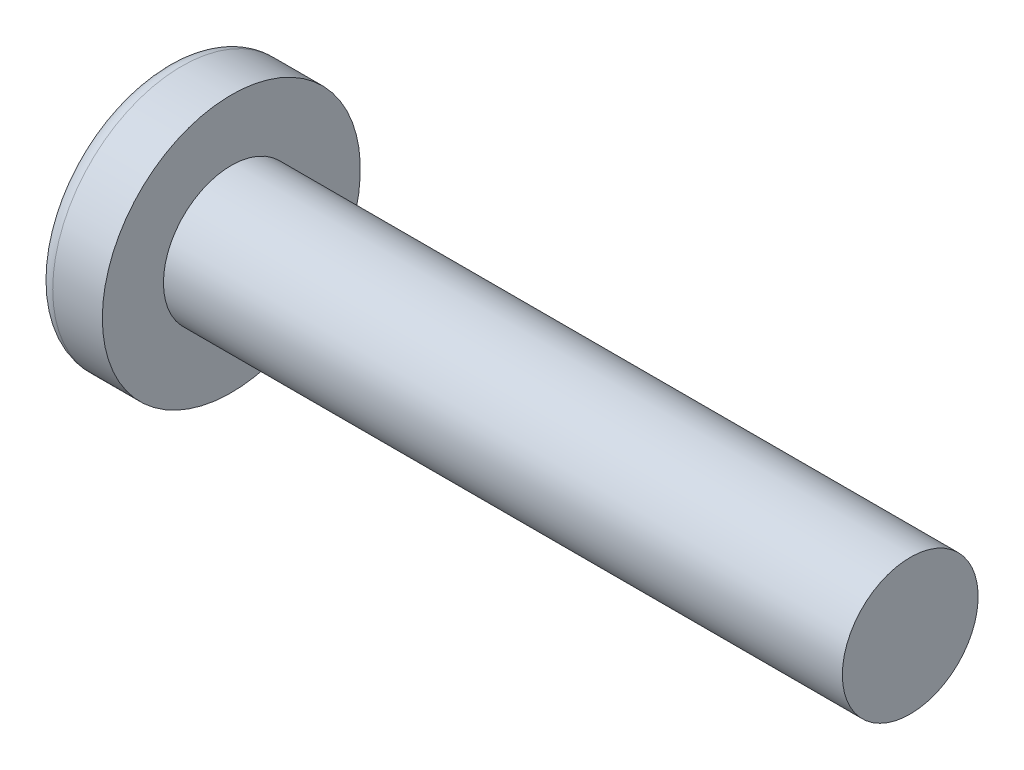
ISO-10303-21;
HEADER;
FILE_DESCRIPTION(('STEP AP214'),'2;1');
FILE_NAME('part.step','',(''),(''),'','','');
FILE_SCHEMA(('AUTOMOTIVE_DESIGN { 1 0 10303 214 1 1 1 1 }'));
ENDSEC;
DATA;
#1=APPLICATION_CONTEXT('core data for automotive mechanical design processes');
#2=APPLICATION_PROTOCOL_DEFINITION('international standard','automotive_design',2000,#1);
#3=PRODUCT_CONTEXT('',#1,'mechanical');
#4=PRODUCT('Part','Part','',(#3));
#5=PRODUCT_RELATED_PRODUCT_CATEGORY('part','',(#4));
#6=PRODUCT_DEFINITION_FORMATION('','',#4);
#7=PRODUCT_DEFINITION_CONTEXT('part definition',#1,'design');
#8=PRODUCT_DEFINITION('design','',#6,#7);
#9=PRODUCT_DEFINITION_SHAPE('','',#8);
#10=(LENGTH_UNIT() NAMED_UNIT(*) SI_UNIT(.MILLI.,.METRE.));
#11=(NAMED_UNIT(*) PLANE_ANGLE_UNIT() SI_UNIT($,.RADIAN.));
#12=(NAMED_UNIT(*) SI_UNIT($,.STERADIAN.) SOLID_ANGLE_UNIT());
#13=UNCERTAINTY_MEASURE_WITH_UNIT(LENGTH_MEASURE(1.E-05),#10,'distance_accuracy_value','');
#14=(GEOMETRIC_REPRESENTATION_CONTEXT(3) GLOBAL_UNCERTAINTY_ASSIGNED_CONTEXT((#13)) GLOBAL_UNIT_ASSIGNED_CONTEXT((#10,
#11,#12)) REPRESENTATION_CONTEXT('',''));
#15=CARTESIAN_POINT('',(0.,0.,0.));
#16=DIRECTION('',(0.,0.,1.));
#17=DIRECTION('',(1.,0.,0.));
#18=AXIS2_PLACEMENT_3D('',#15,#16,#17);
#19=CARTESIAN_POINT('',(8.,0.,0.));
#20=DIRECTION('',(-1.,0.,0.));
#21=DIRECTION('',(0.,1.,0.));
#22=AXIS2_PLACEMENT_3D('',#19,#20,#21);
#23=SPHERICAL_SURFACE('',#22,8.);
#24=CARTESIAN_POINT('',(1.37644815778014,0.,0.));
#25=DIRECTION('',(-1.,0.,0.));
#26=DIRECTION('',(0.,0.,1.));
#27=AXIS2_PLACEMENT_3D('',#24,#25,#26);
#28=CIRCLE('',#27,4.48648648648649);
#29=CARTESIAN_POINT('',(1.37644815778014,0.,4.48648648648649));
#30=VERTEX_POINT('',#29);
#31=EDGE_CURVE('E160',#30,#30,#28,.T.);
#32=ORIENTED_EDGE('',*,*,#31,.T.);
#33=EDGE_LOOP('',(#32));
#34=FACE_BOUND('',#33,.T.);
#35=CARTESIAN_POINT('',(7.98502567027952,-0.176697090701654,0.));
#36=DIRECTION('',(-0.0844430766861806,-0.996428304896931,0.));
#37=DIRECTION('',(0.996428304896931,-0.0844430766861806,0.));
#38=AXIS2_PLACEMENT_3D('',#35,#36,#37);
#39=CIRCLE('',#38,7.99803437774476);
#40=CARTESIAN_POINT('',(0.325131322777776,0.472446498069672,2.20752918301319));
#41=VERTEX_POINT('',#40);
#42=CARTESIAN_POINT('',(0.0309826509964153,0.497374351610472,0.497374351610473));
#43=VERTEX_POINT('',#42);
#44=EDGE_CURVE('E191',#41,#43,#39,.T.);
#45=ORIENTED_EDGE('',*,*,#44,.F.);
#46=CARTESIAN_POINT('',(6.31497138637622,0.,-2.25947018645006));
#47=DIRECTION('',(0.597823879730417,0.,0.801627475093059));
#48=DIRECTION('',(0.801627475093059,0.,-0.597823879730417));
#49=AXIS2_PLACEMENT_3D('',#46,#47,#48);
#50=CIRCLE('',#49,7.48702030502205);
#51=CARTESIAN_POINT('',(0.325131322777776,-0.472446498069688,2.20752918301319));
#52=VERTEX_POINT('',#51);
#53=EDGE_CURVE('E156',#41,#52,#50,.T.);
#54=ORIENTED_EDGE('',*,*,#53,.T.);
#55=CARTESIAN_POINT('',(7.98502567027952,0.176697090701654,0.));
#56=DIRECTION('',(-0.0844430766861806,0.996428304896931,0.));
#57=DIRECTION('',(-0.996428304896931,-0.0844430766861806,0.));
#58=AXIS2_PLACEMENT_3D('',#55,#56,#57);
#59=CIRCLE('',#58,7.99803437774476);
#60=CARTESIAN_POINT('',(0.0309826509964153,-0.497374351610475,0.497374351610473));
#61=VERTEX_POINT('',#60);
#62=EDGE_CURVE('E112',#61,#52,#59,.T.);
#63=ORIENTED_EDGE('',*,*,#62,.F.);
#64=CARTESIAN_POINT('',(7.98502567027952,0.,-0.176697090701654));
#65=DIRECTION('',(-0.0844430766861806,0.,-0.996428304896931));
#66=DIRECTION('',(-0.996428304896931,0.,0.0844430766861806));
#67=AXIS2_PLACEMENT_3D('',#64,#65,#66);
#68=CIRCLE('',#67,7.99803437774476);
#69=CARTESIAN_POINT('',(0.325131322777773,-2.20752918301318,0.47244649806968));
#70=VERTEX_POINT('',#69);
#71=EDGE_CURVE('E137',#70,#61,#68,.T.);
#72=ORIENTED_EDGE('',*,*,#71,.F.);
#73=CARTESIAN_POINT('',(6.31497138637622,2.25947018645007,0.));
#74=DIRECTION('',(0.597823879730417,-0.801627475093059,0.));
#75=DIRECTION('',(0.801627475093059,0.597823879730417,0.));
#76=AXIS2_PLACEMENT_3D('',#73,#74,#75);
#77=CIRCLE('',#76,7.48702030502205);
#78=CARTESIAN_POINT('',(0.325131322777775,-2.20752918301318,-0.47244649806968));
#79=VERTEX_POINT('',#78);
#80=EDGE_CURVE('E145',#70,#79,#77,.T.);
#81=ORIENTED_EDGE('',*,*,#80,.T.);
#82=CARTESIAN_POINT('',(7.98502567027952,0.,0.176697090701654));
#83=DIRECTION('',(-0.0844430766861806,0.,0.996428304896931));
#84=DIRECTION('',(0.996428304896931,0.,0.0844430766861806));
#85=AXIS2_PLACEMENT_3D('',#82,#83,#84);
#86=CIRCLE('',#85,7.99803437774476);
#87=CARTESIAN_POINT('',(0.0309826509964153,-0.497374351610471,-0.497374351610473));
#88=VERTEX_POINT('',#87);
#89=EDGE_CURVE('E55',#88,#79,#86,.T.);
#90=ORIENTED_EDGE('',*,*,#89,.F.);
#91=CARTESIAN_POINT('',(0.325131322777773,-0.472446498069672,-2.20752918301319));
#92=VERTEX_POINT('',#91);
#93=EDGE_CURVE('E198',#92,#88,#59,.T.);
#94=ORIENTED_EDGE('',*,*,#93,.F.);
#95=CARTESIAN_POINT('',(6.31497138637622,0.,2.25947018645006));
#96=DIRECTION('',(0.597823879730417,0.,-0.801627475093059));
#97=DIRECTION('',(-0.801627475093059,0.,-0.597823879730417));
#98=AXIS2_PLACEMENT_3D('',#95,#96,#97);
#99=CIRCLE('',#98,7.48702030502205);
#100=CARTESIAN_POINT('',(0.325131322777775,0.472446498069688,-2.20752918301318));
#101=VERTEX_POINT('',#100);
#102=EDGE_CURVE('E138',#92,#101,#99,.T.);
#103=ORIENTED_EDGE('',*,*,#102,.T.);
#104=CARTESIAN_POINT('',(0.0309826509964153,0.497374351610475,-0.497374351610473));
#105=VERTEX_POINT('',#104);
#106=EDGE_CURVE('E186',#105,#101,#39,.T.);
#107=ORIENTED_EDGE('',*,*,#106,.F.);
#108=CARTESIAN_POINT('',(0.325131322777776,2.20752918301319,-0.47244649806968));
#109=VERTEX_POINT('',#108);
#110=EDGE_CURVE('E48',#109,#105,#86,.T.);
#111=ORIENTED_EDGE('',*,*,#110,.F.);
#112=CARTESIAN_POINT('',(6.31497138637622,-2.25947018645006,0.));
#113=DIRECTION('',(0.597823879730417,0.801627475093059,0.));
#114=DIRECTION('',(-0.801627475093059,0.597823879730417,0.));
#115=AXIS2_PLACEMENT_3D('',#112,#113,#114);
#116=CIRCLE('',#115,7.48702030502205);
#117=CARTESIAN_POINT('',(0.325131322777776,2.20752918301319,0.47244649806968));
#118=VERTEX_POINT('',#117);
#119=EDGE_CURVE('E11',#109,#118,#116,.T.);
#120=ORIENTED_EDGE('',*,*,#119,.T.);
#121=EDGE_CURVE('E174',#43,#118,#68,.T.);
#122=ORIENTED_EDGE('',*,*,#121,.F.);
#123=EDGE_LOOP('',(#45,#54,#63,#72,#81,#90,#94,#103,#107,#111,#120,#122));
#124=FACE_BOUND('',#123,.T.);
#125=ADVANCED_FACE('F40',(#34,#124),#23,.T.);
#126=CARTESIAN_POINT('',(3.28522727272727,0.,-0.221590909090909));
#127=DIRECTION('',(-0.0844430766861806,0.,0.996428304896931));
#128=DIRECTION('',(0.996428304896931,0.,0.0844430766861806));
#129=AXIS2_PLACEMENT_3D('',#126,#127,#128);
#130=PLANE('',#129);
#131=ORIENTED_EDGE('',*,*,#110,.T.);
#132=DIRECTION('',(0.992894609445471,-0.0841436109699554,0.0841436109699551));
#133=VECTOR('',#132,1.);
#134=CARTESIAN_POINT('',(3.30374024870626,0.220022012821504,-0.220022012821503));
#135=LINE('',#134,#133);
#136=CARTESIAN_POINT('',(2.95,0.250000000000001,-0.249999999999999));
#137=VERTEX_POINT('',#136);
#138=EDGE_CURVE('E180',#105,#137,#135,.T.);
#139=ORIENTED_EDGE('',*,*,#138,.T.);
#140=DIRECTION('',(0.799784057588365,-0.596449127693018,0.0677783099651157));
#141=VECTOR('',#140,1.);
#142=CARTESIAN_POINT('',(0.,2.45,-0.5));
#143=LINE('',#142,#141);
#144=EDGE_CURVE('E161',#109,#137,#143,.T.);
#145=ORIENTED_EDGE('',*,*,#144,.F.);
#146=EDGE_LOOP('',(#131,#139,#145));
#147=FACE_BOUND('',#146,.T.);
#148=ADVANCED_FACE('F179',(#147),#130,.T.);
#149=DIRECTION('',(0.799784057588365,0.596449127693018,0.0677783099651157));
#150=VECTOR('',#149,1.);
#151=CARTESIAN_POINT('',(0.,-2.45,-0.5));
#152=LINE('',#151,#150);
#153=CARTESIAN_POINT('',(2.95,-0.25,-0.25));
#154=VERTEX_POINT('',#153);
#155=EDGE_CURVE('E146',#79,#154,#152,.T.);
#156=ORIENTED_EDGE('',*,*,#155,.T.);
#157=DIRECTION('',(-0.992894609445471,-0.0841436109699548,-0.0841436109699552));
#158=VECTOR('',#157,1.);
#159=CARTESIAN_POINT('',(3.30374024870626,-0.220022012821502,-0.220022012821503));
#160=LINE('',#159,#158);
#161=EDGE_CURVE('E201',#154,#88,#160,.T.);
#162=ORIENTED_EDGE('',*,*,#161,.T.);
#163=ORIENTED_EDGE('',*,*,#89,.T.);
#164=EDGE_LOOP('',(#156,#162,#163));
#165=FACE_BOUND('',#164,.T.);
#166=ADVANCED_FACE('F216',(#165),#130,.T.);
#167=CARTESIAN_POINT('',(3.28522727272727,0.,0.221590909090909));
#168=DIRECTION('',(-0.0844430766861806,0.,-0.996428304896931));
#169=DIRECTION('',(-0.996428304896931,0.,0.0844430766861806));
#170=AXIS2_PLACEMENT_3D('',#167,#168,#169);
#171=PLANE('',#170);
#172=DIRECTION('',(0.799784057588365,-0.596449127693018,-0.0677783099651158));
#173=VECTOR('',#172,1.);
#174=CARTESIAN_POINT('',(0.,2.45,0.5));
#175=LINE('',#174,#173);
#176=CARTESIAN_POINT('',(2.95,0.25,0.25));
#177=VERTEX_POINT('',#176);
#178=EDGE_CURVE('E217',#118,#177,#175,.T.);
#179=ORIENTED_EDGE('',*,*,#178,.T.);
#180=DIRECTION('',(-0.992894609445471,0.0841436109699549,0.0841436109699551));
#181=VECTOR('',#180,1.);
#182=CARTESIAN_POINT('',(3.30374024870626,0.220022012821502,0.220022012821503));
#183=LINE('',#182,#181);
#184=EDGE_CURVE('E195',#177,#43,#183,.T.);
#185=ORIENTED_EDGE('',*,*,#184,.T.);
#186=ORIENTED_EDGE('',*,*,#121,.T.);
#187=EDGE_LOOP('',(#179,#185,#186));
#188=FACE_BOUND('',#187,.T.);
#189=ADVANCED_FACE('F221',(#188),#171,.T.);
#190=ORIENTED_EDGE('',*,*,#71,.T.);
#191=DIRECTION('',(0.992894609445471,0.0841436109699554,-0.0841436109699551));
#192=VECTOR('',#191,1.);
#193=CARTESIAN_POINT('',(3.30374024870626,-0.220022012821504,0.220022012821503));
#194=LINE('',#193,#192);
#195=CARTESIAN_POINT('',(2.95,-0.250000000000001,0.249999999999999));
#196=VERTEX_POINT('',#195);
#197=EDGE_CURVE('E110',#61,#196,#194,.T.);
#198=ORIENTED_EDGE('',*,*,#197,.T.);
#199=DIRECTION('',(0.799784057588366,0.596449127693018,-0.0677783099651156));
#200=VECTOR('',#199,1.);
#201=CARTESIAN_POINT('',(0.,-2.45,0.5));
#202=LINE('',#201,#200);
#203=EDGE_CURVE('E135',#70,#196,#202,.T.);
#204=ORIENTED_EDGE('',*,*,#203,.F.);
#205=EDGE_LOOP('',(#190,#198,#204));
#206=FACE_BOUND('',#205,.T.);
#207=ADVANCED_FACE('F134',(#206),#171,.T.);
#208=CARTESIAN_POINT('',(-25.4,0.,0.));
#209=DIRECTION('',(-1.,0.,0.));
#210=DIRECTION('',(0.,0.,1.));
#211=AXIS2_PLACEMENT_3D('',#208,#209,#210);
#212=CYLINDRICAL_SURFACE('',#211,2.5);
#213=CARTESIAN_POINT('',(28.7,0.,0.));
#214=DIRECTION('',(-1.,0.,0.));
#215=DIRECTION('',(0.,0.,1.));
#216=AXIS2_PLACEMENT_3D('',#213,#214,#215);
#217=CIRCLE('',#216,2.5);
#218=CARTESIAN_POINT('',(28.7,0.,2.5));
#219=VERTEX_POINT('',#218);
#220=EDGE_CURVE('E157',#219,#219,#217,.T.);
#221=ORIENTED_EDGE('',*,*,#220,.T.);
#222=EDGE_LOOP('',(#221));
#223=FACE_BOUND('',#222,.T.);
#224=CARTESIAN_POINT('',(3.7,0.,0.));
#225=DIRECTION('',(-1.,0.,0.));
#226=DIRECTION('',(0.,0.,1.));
#227=AXIS2_PLACEMENT_3D('',#224,#225,#226);
#228=CIRCLE('',#227,2.5);
#229=CARTESIAN_POINT('',(3.7,0.,2.5));
#230=VERTEX_POINT('',#229);
#231=EDGE_CURVE('E170',#230,#230,#228,.T.);
#232=ORIENTED_EDGE('',*,*,#231,.F.);
#233=EDGE_LOOP('',(#232));
#234=FACE_BOUND('',#233,.T.);
#235=ADVANCED_FACE('F42',(#223,#234),#212,.T.);
#236=CARTESIAN_POINT('',(3.7,2.5,0.));
#237=DIRECTION('',(-1.,0.,0.));
#238=DIRECTION('',(0.,0.,1.));
#239=AXIS2_PLACEMENT_3D('',#236,#237,#238);
#240=PLANE('',#239);
#241=CARTESIAN_POINT('',(3.7,0.,0.));
#242=DIRECTION('',(-1.,0.,0.));
#243=DIRECTION('',(0.,0.,1.));
#244=AXIS2_PLACEMENT_3D('',#241,#242,#243);
#245=CIRCLE('',#244,4.75);
#246=CARTESIAN_POINT('',(3.7,0.,4.75));
#247=VERTEX_POINT('',#246);
#248=EDGE_CURVE('E167',#247,#247,#245,.T.);
#249=ORIENTED_EDGE('',*,*,#248,.F.);
#250=EDGE_LOOP('',(#249));
#251=FACE_BOUND('',#250,.T.);
#252=ORIENTED_EDGE('',*,*,#231,.T.);
#253=EDGE_LOOP('',(#252));
#254=FACE_BOUND('',#253,.T.);
#255=ADVANCED_FACE('F250',(#251,#254),#240,.F.);
#256=CARTESIAN_POINT('',(-25.4,0.,0.));
#257=DIRECTION('',(-1.,0.,0.));
#258=DIRECTION('',(0.,0.,1.));
#259=AXIS2_PLACEMENT_3D('',#256,#257,#258);
#260=CYLINDRICAL_SURFACE('',#259,4.75);
#261=ORIENTED_EDGE('',*,*,#248,.T.);
#262=EDGE_LOOP('',(#261));
#263=FACE_BOUND('',#262,.T.);
#264=CARTESIAN_POINT('',(1.87321454594663,0.,0.));
#265=DIRECTION('',(-1.,0.,0.));
#266=DIRECTION('',(0.,0.,1.));
#267=AXIS2_PLACEMENT_3D('',#264,#265,#266);
#268=CIRCLE('',#267,4.75);
#269=CARTESIAN_POINT('',(1.87321454594663,0.,4.75));
#270=VERTEX_POINT('',#269);
#271=EDGE_CURVE('E164',#270,#270,#268,.T.);
#272=ORIENTED_EDGE('',*,*,#271,.F.);
#273=EDGE_LOOP('',(#272));
#274=FACE_BOUND('',#273,.T.);
#275=ADVANCED_FACE('F247',(#263,#274),#260,.T.);
#276=CARTESIAN_POINT('',(1.87321454594663,0.,0.));
#277=DIRECTION('',(-1.,0.,0.));
#278=DIRECTION('',(0.,0.,1.));
#279=AXIS2_PLACEMENT_3D('',#276,#277,#278);
#280=TOROIDAL_SURFACE('',#279,4.15,0.599999999999999);
#281=ORIENTED_EDGE('',*,*,#271,.T.);
#282=EDGE_LOOP('',(#281));
#283=FACE_BOUND('',#282,.T.);
#284=ORIENTED_EDGE('',*,*,#31,.F.);
#285=EDGE_LOOP('',(#284));
#286=FACE_BOUND('',#285,.T.);
#287=ADVANCED_FACE('F244',(#283,#286),#280,.T.);
#288=CARTESIAN_POINT('',(28.7,2.5,0.));
#289=DIRECTION('',(1.,0.,0.));
#290=DIRECTION('',(0.,0.,-1.));
#291=AXIS2_PLACEMENT_3D('',#288,#289,#290);
#292=PLANE('',#291);
#293=ORIENTED_EDGE('',*,*,#220,.F.);
#294=EDGE_LOOP('',(#293));
#295=FACE_BOUND('',#294,.T.);
#296=ADVANCED_FACE('F242',(#295),#292,.T.);
#297=CARTESIAN_POINT('',(2.95,0.25,0.25));
#298=DIRECTION('',(0.597823879730417,0.801627475093059,0.));
#299=DIRECTION('',(-0.801627475093059,0.597823879730417,0.));
#300=AXIS2_PLACEMENT_3D('',#297,#298,#299);
#301=PLANE('',#300);
#302=ORIENTED_EDGE('',*,*,#144,.T.);
#303=DIRECTION('',(0.,0.,-1.));
#304=VECTOR('',#303,1.);
#305=CARTESIAN_POINT('',(2.95,0.25,0.25));
#306=LINE('',#305,#304);
#307=EDGE_CURVE('E128',#177,#137,#306,.T.);
#308=ORIENTED_EDGE('',*,*,#307,.F.);
#309=ORIENTED_EDGE('',*,*,#178,.F.);
#310=ORIENTED_EDGE('',*,*,#119,.F.);
#311=EDGE_LOOP('',(#302,#308,#309,#310));
#312=FACE_BOUND('',#311,.T.);
#313=ADVANCED_FACE('F220',(#312),#301,.F.);
#314=CARTESIAN_POINT('',(2.95,-0.25,-0.25));
#315=DIRECTION('',(0.597823879730417,-0.801627475093059,0.));
#316=DIRECTION('',(0.801627475093059,0.597823879730417,0.));
#317=AXIS2_PLACEMENT_3D('',#314,#315,#316);
#318=PLANE('',#317);
#319=ORIENTED_EDGE('',*,*,#203,.T.);
#320=DIRECTION('',(0.,0.,1.));
#321=VECTOR('',#320,1.);
#322=CARTESIAN_POINT('',(2.95,-0.25,-0.25));
#323=LINE('',#322,#321);
#324=EDGE_CURVE('E127',#154,#196,#323,.T.);
#325=ORIENTED_EDGE('',*,*,#324,.F.);
#326=ORIENTED_EDGE('',*,*,#155,.F.);
#327=ORIENTED_EDGE('',*,*,#80,.F.);
#328=EDGE_LOOP('',(#319,#325,#326,#327));
#329=FACE_BOUND('',#328,.T.);
#330=ADVANCED_FACE('F142',(#329),#318,.F.);
#331=CARTESIAN_POINT('',(2.95,0.25,-0.25));
#332=DIRECTION('',(-1.,0.,0.));
#333=DIRECTION('',(0.,0.,1.));
#334=AXIS2_PLACEMENT_3D('',#331,#332,#333);
#335=PLANE('',#334);
#336=DIRECTION('',(0.,1.,0.));
#337=VECTOR('',#336,1.);
#338=CARTESIAN_POINT('',(2.95,-0.25,-0.25));
#339=LINE('',#338,#337);
#340=EDGE_CURVE('E150',#154,#137,#339,.T.);
#341=ORIENTED_EDGE('',*,*,#340,.F.);
#342=ORIENTED_EDGE('',*,*,#324,.T.);
#343=DIRECTION('',(0.,-1.,0.));
#344=VECTOR('',#343,1.);
#345=CARTESIAN_POINT('',(2.95,0.25,0.25));
#346=LINE('',#345,#344);
#347=EDGE_CURVE('E119',#177,#196,#346,.T.);
#348=ORIENTED_EDGE('',*,*,#347,.F.);
#349=ORIENTED_EDGE('',*,*,#307,.T.);
#350=EDGE_LOOP('',(#341,#342,#348,#349));
#351=FACE_BOUND('',#350,.T.);
#352=ADVANCED_FACE('F148',(#351),#335,.T.);
#353=CARTESIAN_POINT('',(2.95,0.250000000000001,-0.249999999999999));
#354=DIRECTION('',(0.597823879730417,0.,-0.801627475093059));
#355=DIRECTION('',(0.801627475093059,0.,0.597823879730417));
#356=AXIS2_PLACEMENT_3D('',#353,#354,#355);
#357=PLANE('',#356);
#358=DIRECTION('',(0.799784057588366,0.0677783099651135,0.596449127693019));
#359=VECTOR('',#358,1.);
#360=CARTESIAN_POINT('',(0.,-0.499999999999991,-2.45));
#361=LINE('',#360,#359);
#362=EDGE_CURVE('E206',#92,#154,#361,.T.);
#363=ORIENTED_EDGE('',*,*,#362,.T.);
#364=ORIENTED_EDGE('',*,*,#340,.T.);
#365=DIRECTION('',(0.799784057588365,-0.0677783099651178,0.596449127693018));
#366=VECTOR('',#365,1.);
#367=CARTESIAN_POINT('',(0.,0.500000000000009,-2.45));
#368=LINE('',#367,#366);
#369=EDGE_CURVE('E116',#101,#137,#368,.T.);
#370=ORIENTED_EDGE('',*,*,#369,.F.);
#371=ORIENTED_EDGE('',*,*,#102,.F.);
#372=EDGE_LOOP('',(#363,#364,#370,#371));
#373=FACE_BOUND('',#372,.T.);
#374=ADVANCED_FACE('F211',(#373),#357,.F.);
#375=CARTESIAN_POINT('',(3.28522727272727,-0.221590909090909,0.));
#376=DIRECTION('',(-0.0844430766861806,0.996428304896931,0.));
#377=DIRECTION('',(-0.996428304896931,-0.0844430766861806,0.));
#378=AXIS2_PLACEMENT_3D('',#375,#376,#377);
#379=PLANE('',#378);
#380=ORIENTED_EDGE('',*,*,#93,.T.);
#381=ORIENTED_EDGE('',*,*,#161,.F.);
#382=ORIENTED_EDGE('',*,*,#362,.F.);
#383=EDGE_LOOP('',(#380,#381,#382));
#384=FACE_BOUND('',#383,.T.);
#385=ADVANCED_FACE('F215',(#384),#379,.T.);
#386=CARTESIAN_POINT('',(3.28522727272727,0.221590909090909,0.));
#387=DIRECTION('',(-0.0844430766861806,-0.996428304896931,0.));
#388=DIRECTION('',(0.996428304896931,-0.0844430766861806,0.));
#389=AXIS2_PLACEMENT_3D('',#386,#387,#388);
#390=PLANE('',#389);
#391=ORIENTED_EDGE('',*,*,#106,.T.);
#392=ORIENTED_EDGE('',*,*,#369,.T.);
#393=ORIENTED_EDGE('',*,*,#138,.F.);
#394=EDGE_LOOP('',(#391,#392,#393));
#395=FACE_BOUND('',#394,.T.);
#396=ADVANCED_FACE('F209',(#395),#390,.T.);
#397=CARTESIAN_POINT('',(2.95,-0.250000000000001,0.249999999999999));
#398=DIRECTION('',(0.597823879730417,0.,0.801627475093059));
#399=DIRECTION('',(-0.801627475093059,0.,0.597823879730417));
#400=AXIS2_PLACEMENT_3D('',#397,#398,#399);
#401=PLANE('',#400);
#402=DIRECTION('',(0.799784057588365,-0.0677783099651136,-0.596449127693019));
#403=VECTOR('',#402,1.);
#404=CARTESIAN_POINT('',(0.,0.499999999999991,2.45));
#405=LINE('',#404,#403);
#406=EDGE_CURVE('E115',#41,#177,#405,.T.);
#407=ORIENTED_EDGE('',*,*,#406,.T.);
#408=ORIENTED_EDGE('',*,*,#347,.T.);
#409=DIRECTION('',(0.799784057588365,0.0677783099651179,-0.596449127693018));
#410=VECTOR('',#409,1.);
#411=CARTESIAN_POINT('',(0.,-0.500000000000009,2.45));
#412=LINE('',#411,#410);
#413=EDGE_CURVE('E106',#52,#196,#412,.T.);
#414=ORIENTED_EDGE('',*,*,#413,.F.);
#415=ORIENTED_EDGE('',*,*,#53,.F.);
#416=EDGE_LOOP('',(#407,#408,#414,#415));
#417=FACE_BOUND('',#416,.T.);
#418=ADVANCED_FACE('F120',(#417),#401,.F.);
#419=ORIENTED_EDGE('',*,*,#44,.T.);
#420=ORIENTED_EDGE('',*,*,#184,.F.);
#421=ORIENTED_EDGE('',*,*,#406,.F.);
#422=EDGE_LOOP('',(#419,#420,#421));
#423=FACE_BOUND('',#422,.T.);
#424=ADVANCED_FACE('F222',(#423),#390,.T.);
#425=ORIENTED_EDGE('',*,*,#62,.T.);
#426=ORIENTED_EDGE('',*,*,#413,.T.);
#427=ORIENTED_EDGE('',*,*,#197,.F.);
#428=EDGE_LOOP('',(#425,#426,#427));
#429=FACE_BOUND('',#428,.T.);
#430=ADVANCED_FACE('F108',(#429),#379,.T.);
#431=CLOSED_SHELL('',(#125,#148,#166,#189,#207,#235,#255,#275,#287,#296,#313,#330,#352,#374,
#385,#396,#418,#424,#430));
#432=MANIFOLD_SOLID_BREP('B2',#431);
#433=ADVANCED_BREP_SHAPE_REPRESENTATION('',(#18,#432),#14);
#434=SHAPE_DEFINITION_REPRESENTATION(#9,#433);
ENDSEC;
END-ISO-10303-21;
